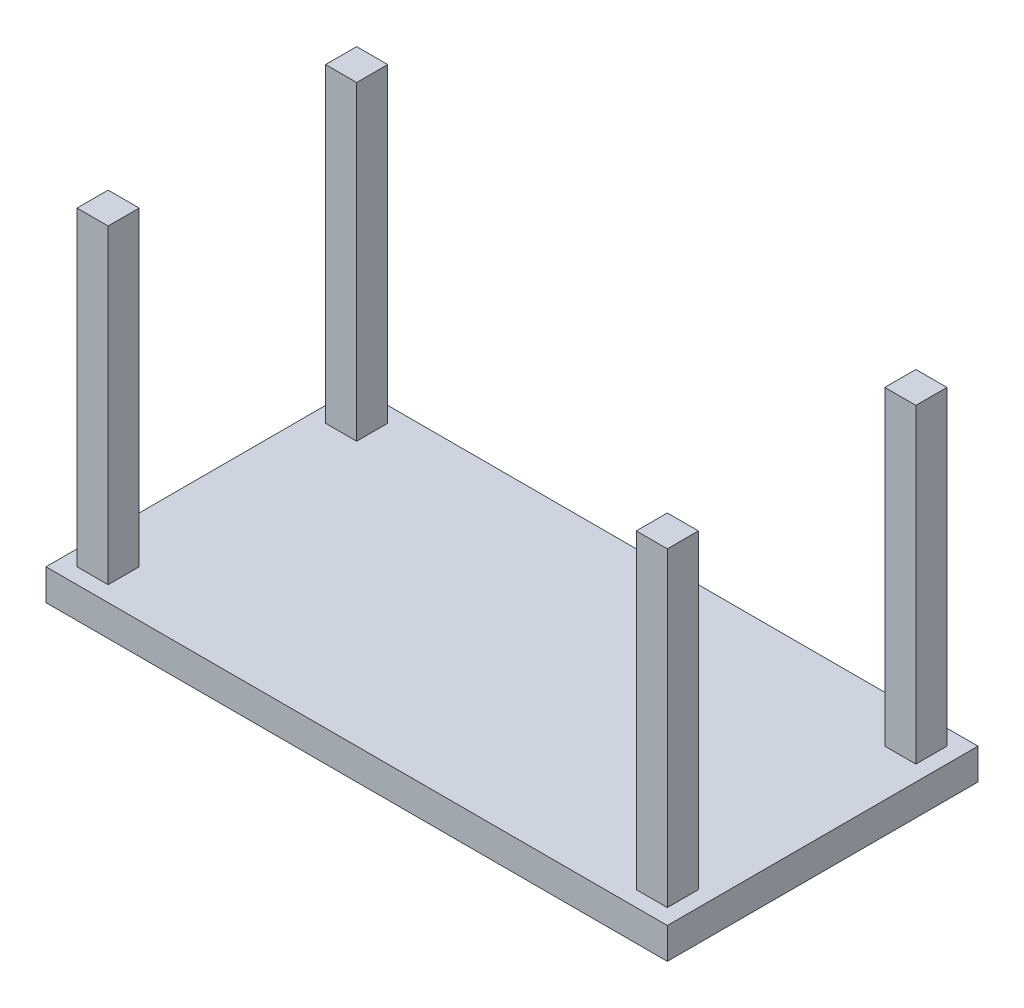
ISO-10303-21;
HEADER;
FILE_DESCRIPTION(('STEP AP214'),'2;1');
FILE_NAME('part.step','',(''),(''),'','','');
FILE_SCHEMA(('AUTOMOTIVE_DESIGN { 1 0 10303 214 1 1 1 1 }'));
ENDSEC;
DATA;
#1=APPLICATION_CONTEXT('core data for automotive mechanical design processes');
#2=APPLICATION_PROTOCOL_DEFINITION('international standard','automotive_design',2000,#1);
#3=PRODUCT_CONTEXT('',#1,'mechanical');
#4=PRODUCT('Part','Part','',(#3));
#5=PRODUCT_RELATED_PRODUCT_CATEGORY('part','',(#4));
#6=PRODUCT_DEFINITION_FORMATION('','',#4);
#7=PRODUCT_DEFINITION_CONTEXT('part definition',#1,'design');
#8=PRODUCT_DEFINITION('design','',#6,#7);
#9=PRODUCT_DEFINITION_SHAPE('','',#8);
#10=(LENGTH_UNIT() NAMED_UNIT(*) SI_UNIT(.MILLI.,.METRE.));
#11=(NAMED_UNIT(*) PLANE_ANGLE_UNIT() SI_UNIT($,.RADIAN.));
#12=(NAMED_UNIT(*) SI_UNIT($,.STERADIAN.) SOLID_ANGLE_UNIT());
#13=UNCERTAINTY_MEASURE_WITH_UNIT(LENGTH_MEASURE(1.E-05),#10,'distance_accuracy_value','');
#14=(GEOMETRIC_REPRESENTATION_CONTEXT(3) GLOBAL_UNCERTAINTY_ASSIGNED_CONTEXT((#13)) GLOBAL_UNIT_ASSIGNED_CONTEXT((#10,
#11,#12)) REPRESENTATION_CONTEXT('',''));
#15=CARTESIAN_POINT('',(0.,0.,0.));
#16=DIRECTION('',(0.,0.,1.));
#17=DIRECTION('',(1.,0.,0.));
#18=AXIS2_PLACEMENT_3D('',#15,#16,#17);
#19=CARTESIAN_POINT('',(0.,10.,0.));
#20=DIRECTION('',(0.,-1.,0.));
#21=DIRECTION('',(0.,0.,-1.));
#22=AXIS2_PLACEMENT_3D('',#19,#20,#21);
#23=PLANE('',#22);
#24=DIRECTION('',(1.,0.,0.));
#25=VECTOR('',#24,1.);
#26=CARTESIAN_POINT('',(95.0000000000001,10.,45.));
#27=LINE('',#26,#25);
#28=CARTESIAN_POINT('',(85.0000000000001,10.,45.));
#29=VERTEX_POINT('',#28);
#30=CARTESIAN_POINT('',(95.0000000000001,10.,45.));
#31=VERTEX_POINT('',#30);
#32=EDGE_CURVE('E253',#29,#31,#27,.T.);
#33=ORIENTED_EDGE('',*,*,#32,.F.);
#34=DIRECTION('',(0.,0.,1.));
#35=VECTOR('',#34,1.);
#36=CARTESIAN_POINT('',(85.0000000000001,10.,45.));
#37=LINE('',#36,#35);
#38=CARTESIAN_POINT('',(85.0000000000001,10.,35.));
#39=VERTEX_POINT('',#38);
#40=EDGE_CURVE('E240',#39,#29,#37,.T.);
#41=ORIENTED_EDGE('',*,*,#40,.F.);
#42=DIRECTION('',(-1.,0.,0.));
#43=VECTOR('',#42,1.);
#44=CARTESIAN_POINT('',(95.0000000000001,10.,35.));
#45=LINE('',#44,#43);
#46=CARTESIAN_POINT('',(95.0000000000001,10.,35.));
#47=VERTEX_POINT('',#46);
#48=EDGE_CURVE('E244',#47,#39,#45,.T.);
#49=ORIENTED_EDGE('',*,*,#48,.F.);
#50=DIRECTION('',(0.,0.,-1.));
#51=VECTOR('',#50,1.);
#52=CARTESIAN_POINT('',(95.0000000000001,10.,45.));
#53=LINE('',#52,#51);
#54=EDGE_CURVE('E249',#31,#47,#53,.T.);
#55=ORIENTED_EDGE('',*,*,#54,.F.);
#56=EDGE_LOOP('',(#33,#41,#49,#55));
#57=FACE_BOUND('',#56,.T.);
#58=DIRECTION('',(0.,0.,-1.));
#59=VECTOR('',#58,1.);
#60=CARTESIAN_POINT('',(-85.,10.,-45.));
#61=LINE('',#60,#59);
#62=CARTESIAN_POINT('',(-85.,10.,-35.));
#63=VERTEX_POINT('',#62);
#64=CARTESIAN_POINT('',(-85.,10.,-45.));
#65=VERTEX_POINT('',#64);
#66=EDGE_CURVE('E302',#63,#65,#61,.T.);
#67=ORIENTED_EDGE('',*,*,#66,.F.);
#68=DIRECTION('',(1.,0.,0.));
#69=VECTOR('',#68,1.);
#70=CARTESIAN_POINT('',(-95.,10.,-35.));
#71=LINE('',#70,#69);
#72=CARTESIAN_POINT('',(-95.,10.,-35.));
#73=VERTEX_POINT('',#72);
#74=EDGE_CURVE('E319',#73,#63,#71,.T.);
#75=ORIENTED_EDGE('',*,*,#74,.F.);
#76=DIRECTION('',(0.,0.,1.));
#77=VECTOR('',#76,1.);
#78=CARTESIAN_POINT('',(-95.,10.,-45.));
#79=LINE('',#78,#77);
#80=CARTESIAN_POINT('',(-95.,10.,-45.));
#81=VERTEX_POINT('',#80);
#82=EDGE_CURVE('E336',#81,#73,#79,.T.);
#83=ORIENTED_EDGE('',*,*,#82,.F.);
#84=DIRECTION('',(-1.,0.,0.));
#85=VECTOR('',#84,1.);
#86=CARTESIAN_POINT('',(-95.,10.,-45.));
#87=LINE('',#86,#85);
#88=EDGE_CURVE('E332',#65,#81,#87,.T.);
#89=ORIENTED_EDGE('',*,*,#88,.F.);
#90=EDGE_LOOP('',(#67,#75,#83,#89));
#91=FACE_BOUND('',#90,.T.);
#92=DIRECTION('',(0.,0.,1.));
#93=VECTOR('',#92,1.);
#94=CARTESIAN_POINT('',(-100.,10.,-50.));
#95=LINE('',#94,#93);
#96=CARTESIAN_POINT('',(-100.,10.,-50.));
#97=VERTEX_POINT('',#96);
#98=CARTESIAN_POINT('',(-100.,10.,50.));
#99=VERTEX_POINT('',#98);
#100=EDGE_CURVE('E359',#97,#99,#95,.T.);
#101=ORIENTED_EDGE('',*,*,#100,.T.);
#102=DIRECTION('',(1.,0.,0.));
#103=VECTOR('',#102,1.);
#104=CARTESIAN_POINT('',(100.,10.,50.));
#105=LINE('',#104,#103);
#106=CARTESIAN_POINT('',(100.,10.,50.));
#107=VERTEX_POINT('',#106);
#108=EDGE_CURVE('E363',#99,#107,#105,.T.);
#109=ORIENTED_EDGE('',*,*,#108,.T.);
#110=DIRECTION('',(0.,0.,-1.));
#111=VECTOR('',#110,1.);
#112=CARTESIAN_POINT('',(100.,10.,-50.));
#113=LINE('',#112,#111);
#114=CARTESIAN_POINT('',(100.,10.,-50.));
#115=VERTEX_POINT('',#114);
#116=EDGE_CURVE('E367',#107,#115,#113,.T.);
#117=ORIENTED_EDGE('',*,*,#116,.T.);
#118=DIRECTION('',(-1.,0.,0.));
#119=VECTOR('',#118,1.);
#120=CARTESIAN_POINT('',(100.,10.,-50.));
#121=LINE('',#120,#119);
#122=EDGE_CURVE('E370',#115,#97,#121,.T.);
#123=ORIENTED_EDGE('',*,*,#122,.T.);
#124=EDGE_LOOP('',(#101,#109,#117,#123));
#125=FACE_BOUND('',#124,.T.);
#126=DIRECTION('',(-1.,0.,0.));
#127=VECTOR('',#126,1.);
#128=CARTESIAN_POINT('',(95.0000000000001,10.,-45.));
#129=LINE('',#128,#127);
#130=CARTESIAN_POINT('',(95.0000000000001,10.,-45.));
#131=VERTEX_POINT('',#130);
#132=CARTESIAN_POINT('',(85.0000000000001,10.,-45.));
#133=VERTEX_POINT('',#132);
#134=EDGE_CURVE('E298',#131,#133,#129,.T.);
#135=ORIENTED_EDGE('',*,*,#134,.F.);
#136=DIRECTION('',(0.,0.,-1.));
#137=VECTOR('',#136,1.);
#138=CARTESIAN_POINT('',(95.0000000000001,10.,-45.));
#139=LINE('',#138,#137);
#140=CARTESIAN_POINT('',(95.0000000000001,10.,-35.));
#141=VERTEX_POINT('',#140);
#142=EDGE_CURVE('E285',#141,#131,#139,.T.);
#143=ORIENTED_EDGE('',*,*,#142,.F.);
#144=DIRECTION('',(1.,0.,0.));
#145=VECTOR('',#144,1.);
#146=CARTESIAN_POINT('',(95.0000000000001,10.,-35.));
#147=LINE('',#146,#145);
#148=CARTESIAN_POINT('',(85.0000000000001,10.,-35.));
#149=VERTEX_POINT('',#148);
#150=EDGE_CURVE('E289',#149,#141,#147,.T.);
#151=ORIENTED_EDGE('',*,*,#150,.F.);
#152=DIRECTION('',(0.,0.,1.));
#153=VECTOR('',#152,1.);
#154=CARTESIAN_POINT('',(85.0000000000001,10.,-45.));
#155=LINE('',#154,#153);
#156=EDGE_CURVE('E294',#133,#149,#155,.T.);
#157=ORIENTED_EDGE('',*,*,#156,.F.);
#158=EDGE_LOOP('',(#135,#143,#151,#157));
#159=FACE_BOUND('',#158,.T.);
#160=DIRECTION('',(0.,0.,1.));
#161=VECTOR('',#160,1.);
#162=CARTESIAN_POINT('',(-95.,10.,45.));
#163=LINE('',#162,#161);
#164=CARTESIAN_POINT('',(-95.,10.,35.));
#165=VERTEX_POINT('',#164);
#166=CARTESIAN_POINT('',(-95.,10.,45.));
#167=VERTEX_POINT('',#166);
#168=EDGE_CURVE('E179',#165,#167,#163,.T.);
#169=ORIENTED_EDGE('',*,*,#168,.F.);
#170=DIRECTION('',(-1.,0.,0.));
#171=VECTOR('',#170,1.);
#172=CARTESIAN_POINT('',(-95.,10.,35.));
#173=LINE('',#172,#171);
#174=CARTESIAN_POINT('',(-85.,10.,35.));
#175=VERTEX_POINT('',#174);
#176=EDGE_CURVE('E181',#175,#165,#173,.T.);
#177=ORIENTED_EDGE('',*,*,#176,.F.);
#178=DIRECTION('',(0.,0.,-1.));
#179=VECTOR('',#178,1.);
#180=CARTESIAN_POINT('',(-85.,10.,45.));
#181=LINE('',#180,#179);
#182=CARTESIAN_POINT('',(-85.,10.,45.));
#183=VERTEX_POINT('',#182);
#184=EDGE_CURVE('E66',#183,#175,#181,.T.);
#185=ORIENTED_EDGE('',*,*,#184,.F.);
#186=DIRECTION('',(1.,0.,0.));
#187=VECTOR('',#186,1.);
#188=CARTESIAN_POINT('',(-95.,10.,45.));
#189=LINE('',#188,#187);
#190=EDGE_CURVE('E61',#167,#183,#189,.T.);
#191=ORIENTED_EDGE('',*,*,#190,.F.);
#192=EDGE_LOOP('',(#169,#177,#185,#191));
#193=FACE_BOUND('',#192,.T.);
#194=ADVANCED_FACE('F45',(#57,#91,#125,#159,#193),#23,.F.);
#195=CARTESIAN_POINT('',(-100.,10.,-50.));
#196=DIRECTION('',(1.,0.,0.));
#197=DIRECTION('',(0.,0.,-1.));
#198=AXIS2_PLACEMENT_3D('',#195,#196,#197);
#199=PLANE('',#198);
#200=DIRECTION('',(0.,0.,1.));
#201=VECTOR('',#200,1.);
#202=CARTESIAN_POINT('',(-100.,0.,-50.));
#203=LINE('',#202,#201);
#204=CARTESIAN_POINT('',(-100.,0.,-50.));
#205=VERTEX_POINT('',#204);
#206=CARTESIAN_POINT('',(-100.,0.,50.));
#207=VERTEX_POINT('',#206);
#208=EDGE_CURVE('E358',#205,#207,#203,.T.);
#209=ORIENTED_EDGE('',*,*,#208,.T.);
#210=DIRECTION('',(0.,-1.,0.));
#211=VECTOR('',#210,1.);
#212=CARTESIAN_POINT('',(-100.,10.,50.));
#213=LINE('',#212,#211);
#214=EDGE_CURVE('E11',#99,#207,#213,.T.);
#215=ORIENTED_EDGE('',*,*,#214,.F.);
#216=ORIENTED_EDGE('',*,*,#100,.F.);
#217=DIRECTION('',(0.,-1.,0.));
#218=VECTOR('',#217,1.);
#219=CARTESIAN_POINT('',(-100.,10.,-50.));
#220=LINE('',#219,#218);
#221=EDGE_CURVE('E373',#97,#205,#220,.T.);
#222=ORIENTED_EDGE('',*,*,#221,.T.);
#223=EDGE_LOOP('',(#209,#215,#216,#222));
#224=FACE_BOUND('',#223,.T.);
#225=ADVANCED_FACE('F47',(#224),#199,.F.);
#226=CARTESIAN_POINT('',(100.,10.,50.));
#227=DIRECTION('',(0.,0.,-1.));
#228=DIRECTION('',(-1.,0.,0.));
#229=AXIS2_PLACEMENT_3D('',#226,#227,#228);
#230=PLANE('',#229);
#231=DIRECTION('',(1.,0.,0.));
#232=VECTOR('',#231,1.);
#233=CARTESIAN_POINT('',(100.,0.,50.));
#234=LINE('',#233,#232);
#235=CARTESIAN_POINT('',(100.,0.,50.));
#236=VERTEX_POINT('',#235);
#237=EDGE_CURVE('E377',#207,#236,#234,.T.);
#238=ORIENTED_EDGE('',*,*,#237,.T.);
#239=DIRECTION('',(0.,-1.,0.));
#240=VECTOR('',#239,1.);
#241=CARTESIAN_POINT('',(100.,10.,50.));
#242=LINE('',#241,#240);
#243=EDGE_CURVE('E54',#107,#236,#242,.T.);
#244=ORIENTED_EDGE('',*,*,#243,.F.);
#245=ORIENTED_EDGE('',*,*,#108,.F.);
#246=ORIENTED_EDGE('',*,*,#214,.T.);
#247=EDGE_LOOP('',(#238,#244,#245,#246));
#248=FACE_BOUND('',#247,.T.);
#249=ADVANCED_FACE('F413',(#248),#230,.F.);
#250=CARTESIAN_POINT('',(100.,10.,-50.));
#251=DIRECTION('',(-1.,0.,0.));
#252=DIRECTION('',(0.,0.,1.));
#253=AXIS2_PLACEMENT_3D('',#250,#251,#252);
#254=PLANE('',#253);
#255=DIRECTION('',(0.,0.,-1.));
#256=VECTOR('',#255,1.);
#257=CARTESIAN_POINT('',(100.,0.,-50.));
#258=LINE('',#257,#256);
#259=CARTESIAN_POINT('',(100.,0.,-50.));
#260=VERTEX_POINT('',#259);
#261=EDGE_CURVE('E380',#236,#260,#258,.T.);
#262=ORIENTED_EDGE('',*,*,#261,.T.);
#263=DIRECTION('',(0.,-1.,0.));
#264=VECTOR('',#263,1.);
#265=CARTESIAN_POINT('',(100.,10.,-50.));
#266=LINE('',#265,#264);
#267=EDGE_CURVE('E388',#115,#260,#266,.T.);
#268=ORIENTED_EDGE('',*,*,#267,.F.);
#269=ORIENTED_EDGE('',*,*,#116,.F.);
#270=ORIENTED_EDGE('',*,*,#243,.T.);
#271=EDGE_LOOP('',(#262,#268,#269,#270));
#272=FACE_BOUND('',#271,.T.);
#273=ADVANCED_FACE('F397',(#272),#254,.F.);
#274=CARTESIAN_POINT('',(100.,10.,-50.));
#275=DIRECTION('',(0.,0.,1.));
#276=DIRECTION('',(1.,0.,0.));
#277=AXIS2_PLACEMENT_3D('',#274,#275,#276);
#278=PLANE('',#277);
#279=DIRECTION('',(-1.,0.,0.));
#280=VECTOR('',#279,1.);
#281=CARTESIAN_POINT('',(100.,0.,-50.));
#282=LINE('',#281,#280);
#283=EDGE_CURVE('E364',#260,#205,#282,.T.);
#284=ORIENTED_EDGE('',*,*,#283,.T.);
#285=ORIENTED_EDGE('',*,*,#221,.F.);
#286=ORIENTED_EDGE('',*,*,#122,.F.);
#287=ORIENTED_EDGE('',*,*,#267,.T.);
#288=EDGE_LOOP('',(#284,#285,#286,#287));
#289=FACE_BOUND('',#288,.T.);
#290=ADVANCED_FACE('F406',(#289),#278,.F.);
#291=CARTESIAN_POINT('',(0.,0.,0.));
#292=DIRECTION('',(0.,-1.,0.));
#293=DIRECTION('',(0.,0.,-1.));
#294=AXIS2_PLACEMENT_3D('',#291,#292,#293);
#295=PLANE('',#294);
#296=ORIENTED_EDGE('',*,*,#208,.F.);
#297=ORIENTED_EDGE('',*,*,#283,.F.);
#298=ORIENTED_EDGE('',*,*,#261,.F.);
#299=ORIENTED_EDGE('',*,*,#237,.F.);
#300=EDGE_LOOP('',(#296,#297,#298,#299));
#301=FACE_BOUND('',#300,.T.);
#302=ADVANCED_FACE('F403',(#301),#295,.T.);
#303=CARTESIAN_POINT('',(-85.,110.,-45.));
#304=DIRECTION('',(-1.,0.,0.));
#305=DIRECTION('',(0.,0.,1.));
#306=AXIS2_PLACEMENT_3D('',#303,#304,#305);
#307=PLANE('',#306);
#308=ORIENTED_EDGE('',*,*,#66,.T.);
#309=DIRECTION('',(0.,-1.,0.));
#310=VECTOR('',#309,1.);
#311=CARTESIAN_POINT('',(-85.,110.,-45.));
#312=LINE('',#311,#310);
#313=CARTESIAN_POINT('',(-85.,110.,-45.));
#314=VERTEX_POINT('',#313);
#315=EDGE_CURVE('E354',#314,#65,#312,.T.);
#316=ORIENTED_EDGE('',*,*,#315,.F.);
#317=DIRECTION('',(0.,0.,-1.));
#318=VECTOR('',#317,1.);
#319=CARTESIAN_POINT('',(-85.,110.,-45.));
#320=LINE('',#319,#318);
#321=CARTESIAN_POINT('',(-85.,110.,-35.));
#322=VERTEX_POINT('',#321);
#323=EDGE_CURVE('E314',#322,#314,#320,.T.);
#324=ORIENTED_EDGE('',*,*,#323,.F.);
#325=DIRECTION('',(0.,-1.,0.));
#326=VECTOR('',#325,1.);
#327=CARTESIAN_POINT('',(-85.,110.,-35.));
#328=LINE('',#327,#326);
#329=EDGE_CURVE('E328',#322,#63,#328,.T.);
#330=ORIENTED_EDGE('',*,*,#329,.T.);
#331=EDGE_LOOP('',(#308,#316,#324,#330));
#332=FACE_BOUND('',#331,.T.);
#333=ADVANCED_FACE('F430',(#332),#307,.F.);
#334=CARTESIAN_POINT('',(-95.,110.,-45.));
#335=DIRECTION('',(0.,0.,1.));
#336=DIRECTION('',(1.,0.,0.));
#337=AXIS2_PLACEMENT_3D('',#334,#335,#336);
#338=PLANE('',#337);
#339=ORIENTED_EDGE('',*,*,#88,.T.);
#340=DIRECTION('',(0.,-1.,0.));
#341=VECTOR('',#340,1.);
#342=CARTESIAN_POINT('',(-95.,110.,-45.));
#343=LINE('',#342,#341);
#344=CARTESIAN_POINT('',(-95.,110.,-45.));
#345=VERTEX_POINT('',#344);
#346=EDGE_CURVE('E350',#345,#81,#343,.T.);
#347=ORIENTED_EDGE('',*,*,#346,.F.);
#348=DIRECTION('',(-1.,0.,0.));
#349=VECTOR('',#348,1.);
#350=CARTESIAN_POINT('',(-95.,110.,-45.));
#351=LINE('',#350,#349);
#352=EDGE_CURVE('E318',#314,#345,#351,.T.);
#353=ORIENTED_EDGE('',*,*,#352,.F.);
#354=ORIENTED_EDGE('',*,*,#315,.T.);
#355=EDGE_LOOP('',(#339,#347,#353,#354));
#356=FACE_BOUND('',#355,.T.);
#357=ADVANCED_FACE('F456',(#356),#338,.F.);
#358=CARTESIAN_POINT('',(-95.,110.,-45.));
#359=DIRECTION('',(1.,0.,0.));
#360=DIRECTION('',(0.,0.,-1.));
#361=AXIS2_PLACEMENT_3D('',#358,#359,#360);
#362=PLANE('',#361);
#363=ORIENTED_EDGE('',*,*,#82,.T.);
#364=DIRECTION('',(0.,-1.,0.));
#365=VECTOR('',#364,1.);
#366=CARTESIAN_POINT('',(-95.,110.,-35.));
#367=LINE('',#366,#365);
#368=CARTESIAN_POINT('',(-95.,110.,-35.));
#369=VERTEX_POINT('',#368);
#370=EDGE_CURVE('E346',#369,#73,#367,.T.);
#371=ORIENTED_EDGE('',*,*,#370,.F.);
#372=DIRECTION('',(0.,0.,1.));
#373=VECTOR('',#372,1.);
#374=CARTESIAN_POINT('',(-95.,110.,-45.));
#375=LINE('',#374,#373);
#376=EDGE_CURVE('E322',#345,#369,#375,.T.);
#377=ORIENTED_EDGE('',*,*,#376,.F.);
#378=ORIENTED_EDGE('',*,*,#346,.T.);
#379=EDGE_LOOP('',(#363,#371,#377,#378));
#380=FACE_BOUND('',#379,.T.);
#381=ADVANCED_FACE('F465',(#380),#362,.F.);
#382=CARTESIAN_POINT('',(-95.,110.,-35.));
#383=DIRECTION('',(0.,0.,-1.));
#384=DIRECTION('',(-1.,0.,0.));
#385=AXIS2_PLACEMENT_3D('',#382,#383,#384);
#386=PLANE('',#385);
#387=ORIENTED_EDGE('',*,*,#74,.T.);
#388=ORIENTED_EDGE('',*,*,#329,.F.);
#389=DIRECTION('',(1.,0.,0.));
#390=VECTOR('',#389,1.);
#391=CARTESIAN_POINT('',(-95.,110.,-35.));
#392=LINE('',#391,#390);
#393=EDGE_CURVE('E325',#369,#322,#392,.T.);
#394=ORIENTED_EDGE('',*,*,#393,.F.);
#395=ORIENTED_EDGE('',*,*,#370,.T.);
#396=EDGE_LOOP('',(#387,#388,#394,#395));
#397=FACE_BOUND('',#396,.T.);
#398=ADVANCED_FACE('F474',(#397),#386,.F.);
#399=CARTESIAN_POINT('',(0.,110.,0.));
#400=DIRECTION('',(0.,1.,0.));
#401=DIRECTION('',(0.,0.,1.));
#402=AXIS2_PLACEMENT_3D('',#399,#400,#401);
#403=PLANE('',#402);
#404=ORIENTED_EDGE('',*,*,#323,.T.);
#405=ORIENTED_EDGE('',*,*,#352,.T.);
#406=ORIENTED_EDGE('',*,*,#376,.T.);
#407=ORIENTED_EDGE('',*,*,#393,.T.);
#408=EDGE_LOOP('',(#404,#405,#406,#407));
#409=FACE_BOUND('',#408,.T.);
#410=ADVANCED_FACE('F484',(#409),#403,.T.);
#411=CARTESIAN_POINT('',(95.0000000000001,110.,-45.));
#412=DIRECTION('',(0.,0.,1.));
#413=DIRECTION('',(1.,0.,0.));
#414=AXIS2_PLACEMENT_3D('',#411,#412,#413);
#415=PLANE('',#414);
#416=ORIENTED_EDGE('',*,*,#134,.T.);
#417=DIRECTION('',(0.,-1.,0.));
#418=VECTOR('',#417,1.);
#419=CARTESIAN_POINT('',(85.0000000000001,110.,-45.));
#420=LINE('',#419,#418);
#421=CARTESIAN_POINT('',(85.0000000000001,110.,-45.));
#422=VERTEX_POINT('',#421);
#423=EDGE_CURVE('E257',#422,#133,#420,.T.);
#424=ORIENTED_EDGE('',*,*,#423,.F.);
#425=DIRECTION('',(-1.,0.,0.));
#426=VECTOR('',#425,1.);
#427=CARTESIAN_POINT('',(95.0000000000001,110.,-45.));
#428=LINE('',#427,#426);
#429=CARTESIAN_POINT('',(95.0000000000001,110.,-45.));
#430=VERTEX_POINT('',#429);
#431=EDGE_CURVE('E290',#430,#422,#428,.T.);
#432=ORIENTED_EDGE('',*,*,#431,.F.);
#433=DIRECTION('',(0.,-1.,0.));
#434=VECTOR('',#433,1.);
#435=CARTESIAN_POINT('',(95.0000000000001,110.,-45.));
#436=LINE('',#435,#434);
#437=EDGE_CURVE('E280',#430,#131,#436,.T.);
#438=ORIENTED_EDGE('',*,*,#437,.T.);
#439=EDGE_LOOP('',(#416,#424,#432,#438));
#440=FACE_BOUND('',#439,.T.);
#441=ADVANCED_FACE('F494',(#440),#415,.F.);
#442=CARTESIAN_POINT('',(85.0000000000001,110.,-45.));
#443=DIRECTION('',(1.,0.,0.));
#444=DIRECTION('',(0.,0.,-1.));
#445=AXIS2_PLACEMENT_3D('',#442,#443,#444);
#446=PLANE('',#445);
#447=ORIENTED_EDGE('',*,*,#156,.T.);
#448=DIRECTION('',(0.,-1.,0.));
#449=VECTOR('',#448,1.);
#450=CARTESIAN_POINT('',(85.0000000000001,110.,-35.));
#451=LINE('',#450,#449);
#452=CARTESIAN_POINT('',(85.0000000000001,110.,-35.));
#453=VERTEX_POINT('',#452);
#454=EDGE_CURVE('E272',#453,#149,#451,.T.);
#455=ORIENTED_EDGE('',*,*,#454,.F.);
#456=DIRECTION('',(0.,0.,1.));
#457=VECTOR('',#456,1.);
#458=CARTESIAN_POINT('',(85.0000000000001,110.,-45.));
#459=LINE('',#458,#457);
#460=EDGE_CURVE('E308',#422,#453,#459,.T.);
#461=ORIENTED_EDGE('',*,*,#460,.F.);
#462=ORIENTED_EDGE('',*,*,#423,.T.);
#463=EDGE_LOOP('',(#447,#455,#461,#462));
#464=FACE_BOUND('',#463,.T.);
#465=ADVANCED_FACE('F504',(#464),#446,.F.);
#466=CARTESIAN_POINT('',(95.0000000000001,110.,-35.));
#467=DIRECTION('',(0.,0.,-1.));
#468=DIRECTION('',(-1.,0.,0.));
#469=AXIS2_PLACEMENT_3D('',#466,#467,#468);
#470=PLANE('',#469);
#471=ORIENTED_EDGE('',*,*,#150,.T.);
#472=DIRECTION('',(0.,-1.,0.));
#473=VECTOR('',#472,1.);
#474=CARTESIAN_POINT('',(95.0000000000001,110.,-35.));
#475=LINE('',#474,#473);
#476=CARTESIAN_POINT('',(95.0000000000001,110.,-35.));
#477=VERTEX_POINT('',#476);
#478=EDGE_CURVE('E276',#477,#141,#475,.T.);
#479=ORIENTED_EDGE('',*,*,#478,.F.);
#480=DIRECTION('',(1.,0.,0.));
#481=VECTOR('',#480,1.);
#482=CARTESIAN_POINT('',(95.0000000000001,110.,-35.));
#483=LINE('',#482,#481);
#484=EDGE_CURVE('E305',#453,#477,#483,.T.);
#485=ORIENTED_EDGE('',*,*,#484,.F.);
#486=ORIENTED_EDGE('',*,*,#454,.T.);
#487=EDGE_LOOP('',(#471,#479,#485,#486));
#488=FACE_BOUND('',#487,.T.);
#489=ADVANCED_FACE('F514',(#488),#470,.F.);
#490=CARTESIAN_POINT('',(95.0000000000001,110.,-45.));
#491=DIRECTION('',(-1.,0.,0.));
#492=DIRECTION('',(0.,0.,1.));
#493=AXIS2_PLACEMENT_3D('',#490,#491,#492);
#494=PLANE('',#493);
#495=ORIENTED_EDGE('',*,*,#142,.T.);
#496=ORIENTED_EDGE('',*,*,#437,.F.);
#497=DIRECTION('',(0.,0.,-1.));
#498=VECTOR('',#497,1.);
#499=CARTESIAN_POINT('',(95.0000000000001,110.,-45.));
#500=LINE('',#499,#498);
#501=EDGE_CURVE('E284',#477,#430,#500,.T.);
#502=ORIENTED_EDGE('',*,*,#501,.F.);
#503=ORIENTED_EDGE('',*,*,#478,.T.);
#504=EDGE_LOOP('',(#495,#496,#502,#503));
#505=FACE_BOUND('',#504,.T.);
#506=ADVANCED_FACE('F524',(#505),#494,.F.);
#507=CARTESIAN_POINT('',(0.,110.,0.));
#508=DIRECTION('',(0.,1.,0.));
#509=DIRECTION('',(0.,0.,1.));
#510=AXIS2_PLACEMENT_3D('',#507,#508,#509);
#511=PLANE('',#510);
#512=ORIENTED_EDGE('',*,*,#431,.T.);
#513=ORIENTED_EDGE('',*,*,#460,.T.);
#514=ORIENTED_EDGE('',*,*,#484,.T.);
#515=ORIENTED_EDGE('',*,*,#501,.T.);
#516=EDGE_LOOP('',(#512,#513,#514,#515));
#517=FACE_BOUND('',#516,.T.);
#518=ADVANCED_FACE('F534',(#517),#511,.T.);
#519=CARTESIAN_POINT('',(95.0000000000001,110.,45.));
#520=DIRECTION('',(0.,0.,-1.));
#521=DIRECTION('',(-1.,0.,0.));
#522=AXIS2_PLACEMENT_3D('',#519,#520,#521);
#523=PLANE('',#522);
#524=ORIENTED_EDGE('',*,*,#32,.T.);
#525=DIRECTION('',(0.,-1.,0.));
#526=VECTOR('',#525,1.);
#527=CARTESIAN_POINT('',(95.0000000000001,110.,45.));
#528=LINE('',#527,#526);
#529=CARTESIAN_POINT('',(95.0000000000001,110.,45.));
#530=VERTEX_POINT('',#529);
#531=EDGE_CURVE('E186',#530,#31,#528,.T.);
#532=ORIENTED_EDGE('',*,*,#531,.F.);
#533=DIRECTION('',(1.,0.,0.));
#534=VECTOR('',#533,1.);
#535=CARTESIAN_POINT('',(95.0000000000001,110.,45.));
#536=LINE('',#535,#534);
#537=CARTESIAN_POINT('',(85.0000000000001,110.,45.));
#538=VERTEX_POINT('',#537);
#539=EDGE_CURVE('E245',#538,#530,#536,.T.);
#540=ORIENTED_EDGE('',*,*,#539,.F.);
#541=DIRECTION('',(0.,-1.,0.));
#542=VECTOR('',#541,1.);
#543=CARTESIAN_POINT('',(85.0000000000001,110.,45.));
#544=LINE('',#543,#542);
#545=EDGE_CURVE('E235',#538,#29,#544,.T.);
#546=ORIENTED_EDGE('',*,*,#545,.T.);
#547=EDGE_LOOP('',(#524,#532,#540,#546));
#548=FACE_BOUND('',#547,.T.);
#549=ADVANCED_FACE('F544',(#548),#523,.F.);
#550=CARTESIAN_POINT('',(95.0000000000001,110.,45.));
#551=DIRECTION('',(-1.,0.,0.));
#552=DIRECTION('',(0.,0.,1.));
#553=AXIS2_PLACEMENT_3D('',#550,#551,#552);
#554=PLANE('',#553);
#555=ORIENTED_EDGE('',*,*,#54,.T.);
#556=DIRECTION('',(0.,-1.,0.));
#557=VECTOR('',#556,1.);
#558=CARTESIAN_POINT('',(95.0000000000001,110.,35.));
#559=LINE('',#558,#557);
#560=CARTESIAN_POINT('',(95.0000000000001,110.,35.));
#561=VERTEX_POINT('',#560);
#562=EDGE_CURVE('E227',#561,#47,#559,.T.);
#563=ORIENTED_EDGE('',*,*,#562,.F.);
#564=DIRECTION('',(0.,0.,-1.));
#565=VECTOR('',#564,1.);
#566=CARTESIAN_POINT('',(95.0000000000001,110.,45.));
#567=LINE('',#566,#565);
#568=EDGE_CURVE('E263',#530,#561,#567,.T.);
#569=ORIENTED_EDGE('',*,*,#568,.F.);
#570=ORIENTED_EDGE('',*,*,#531,.T.);
#571=EDGE_LOOP('',(#555,#563,#569,#570));
#572=FACE_BOUND('',#571,.T.);
#573=ADVANCED_FACE('F554',(#572),#554,.F.);
#574=CARTESIAN_POINT('',(95.0000000000001,110.,35.));
#575=DIRECTION('',(0.,0.,1.));
#576=DIRECTION('',(1.,0.,0.));
#577=AXIS2_PLACEMENT_3D('',#574,#575,#576);
#578=PLANE('',#577);
#579=ORIENTED_EDGE('',*,*,#48,.T.);
#580=DIRECTION('',(0.,-1.,0.));
#581=VECTOR('',#580,1.);
#582=CARTESIAN_POINT('',(85.0000000000001,110.,35.));
#583=LINE('',#582,#581);
#584=CARTESIAN_POINT('',(85.0000000000001,110.,35.));
#585=VERTEX_POINT('',#584);
#586=EDGE_CURVE('E231',#585,#39,#583,.T.);
#587=ORIENTED_EDGE('',*,*,#586,.F.);
#588=DIRECTION('',(-1.,0.,0.));
#589=VECTOR('',#588,1.);
#590=CARTESIAN_POINT('',(95.0000000000001,110.,35.));
#591=LINE('',#590,#589);
#592=EDGE_CURVE('E260',#561,#585,#591,.T.);
#593=ORIENTED_EDGE('',*,*,#592,.F.);
#594=ORIENTED_EDGE('',*,*,#562,.T.);
#595=EDGE_LOOP('',(#579,#587,#593,#594));
#596=FACE_BOUND('',#595,.T.);
#597=ADVANCED_FACE('F564',(#596),#578,.F.);
#598=CARTESIAN_POINT('',(85.0000000000001,110.,45.));
#599=DIRECTION('',(1.,0.,0.));
#600=DIRECTION('',(0.,0.,-1.));
#601=AXIS2_PLACEMENT_3D('',#598,#599,#600);
#602=PLANE('',#601);
#603=ORIENTED_EDGE('',*,*,#40,.T.);
#604=ORIENTED_EDGE('',*,*,#545,.F.);
#605=DIRECTION('',(0.,0.,1.));
#606=VECTOR('',#605,1.);
#607=CARTESIAN_POINT('',(85.0000000000001,110.,45.));
#608=LINE('',#607,#606);
#609=EDGE_CURVE('E239',#585,#538,#608,.T.);
#610=ORIENTED_EDGE('',*,*,#609,.F.);
#611=ORIENTED_EDGE('',*,*,#586,.T.);
#612=EDGE_LOOP('',(#603,#604,#610,#611));
#613=FACE_BOUND('',#612,.T.);
#614=ADVANCED_FACE('F574',(#613),#602,.F.);
#615=CARTESIAN_POINT('',(0.,110.,0.));
#616=DIRECTION('',(0.,-1.,0.));
#617=DIRECTION('',(0.,0.,-1.));
#618=AXIS2_PLACEMENT_3D('',#615,#616,#617);
#619=PLANE('',#618);
#620=ORIENTED_EDGE('',*,*,#539,.T.);
#621=ORIENTED_EDGE('',*,*,#568,.T.);
#622=ORIENTED_EDGE('',*,*,#592,.T.);
#623=ORIENTED_EDGE('',*,*,#609,.T.);
#624=EDGE_LOOP('',(#620,#621,#622,#623));
#625=FACE_BOUND('',#624,.T.);
#626=ADVANCED_FACE('F584',(#625),#619,.F.);
#627=CARTESIAN_POINT('',(-95.,110.,45.));
#628=DIRECTION('',(1.,0.,0.));
#629=DIRECTION('',(0.,0.,-1.));
#630=AXIS2_PLACEMENT_3D('',#627,#628,#629);
#631=PLANE('',#630);
#632=ORIENTED_EDGE('',*,*,#168,.T.);
#633=DIRECTION('',(0.,-1.,0.));
#634=VECTOR('',#633,1.);
#635=CARTESIAN_POINT('',(-95.,110.,45.));
#636=LINE('',#635,#634);
#637=CARTESIAN_POINT('',(-95.,110.,45.));
#638=VERTEX_POINT('',#637);
#639=EDGE_CURVE('E644',#638,#167,#636,.T.);
#640=ORIENTED_EDGE('',*,*,#639,.F.);
#641=DIRECTION('',(0.,0.,1.));
#642=VECTOR('',#641,1.);
#643=CARTESIAN_POINT('',(-95.,110.,45.));
#644=LINE('',#643,#642);
#645=CARTESIAN_POINT('',(-95.,110.,35.));
#646=VERTEX_POINT('',#645);
#647=EDGE_CURVE('E198',#646,#638,#644,.T.);
#648=ORIENTED_EDGE('',*,*,#647,.F.);
#649=DIRECTION('',(0.,-1.,0.));
#650=VECTOR('',#649,1.);
#651=CARTESIAN_POINT('',(-95.,110.,35.));
#652=LINE('',#651,#650);
#653=EDGE_CURVE('E193',#646,#165,#652,.T.);
#654=ORIENTED_EDGE('',*,*,#653,.T.);
#655=EDGE_LOOP('',(#632,#640,#648,#654));
#656=FACE_BOUND('',#655,.T.);
#657=ADVANCED_FACE('F200',(#656),#631,.F.);
#658=CARTESIAN_POINT('',(-95.,110.,45.));
#659=DIRECTION('',(0.,0.,-1.));
#660=DIRECTION('',(-1.,0.,0.));
#661=AXIS2_PLACEMENT_3D('',#658,#659,#660);
#662=PLANE('',#661);
#663=ORIENTED_EDGE('',*,*,#190,.T.);
#664=DIRECTION('',(0.,-1.,0.));
#665=VECTOR('',#664,1.);
#666=CARTESIAN_POINT('',(-85.,110.,45.));
#667=LINE('',#666,#665);
#668=CARTESIAN_POINT('',(-85.,110.,45.));
#669=VERTEX_POINT('',#668);
#670=EDGE_CURVE('E209',#669,#183,#667,.T.);
#671=ORIENTED_EDGE('',*,*,#670,.F.);
#672=DIRECTION('',(1.,0.,0.));
#673=VECTOR('',#672,1.);
#674=CARTESIAN_POINT('',(-95.,110.,45.));
#675=LINE('',#674,#673);
#676=EDGE_CURVE('E219',#638,#669,#675,.T.);
#677=ORIENTED_EDGE('',*,*,#676,.F.);
#678=ORIENTED_EDGE('',*,*,#639,.T.);
#679=EDGE_LOOP('',(#663,#671,#677,#678));
#680=FACE_BOUND('',#679,.T.);
#681=ADVANCED_FACE('F603',(#680),#662,.F.);
#682=CARTESIAN_POINT('',(-85.,110.,45.));
#683=DIRECTION('',(-1.,0.,0.));
#684=DIRECTION('',(0.,0.,1.));
#685=AXIS2_PLACEMENT_3D('',#682,#683,#684);
#686=PLANE('',#685);
#687=ORIENTED_EDGE('',*,*,#184,.T.);
#688=DIRECTION('',(0.,-1.,0.));
#689=VECTOR('',#688,1.);
#690=CARTESIAN_POINT('',(-85.,110.,35.));
#691=LINE('',#690,#689);
#692=CARTESIAN_POINT('',(-85.,110.,35.));
#693=VERTEX_POINT('',#692);
#694=EDGE_CURVE('E196',#693,#175,#691,.T.);
#695=ORIENTED_EDGE('',*,*,#694,.F.);
#696=DIRECTION('',(0.,0.,-1.));
#697=VECTOR('',#696,1.);
#698=CARTESIAN_POINT('',(-85.,110.,45.));
#699=LINE('',#698,#697);
#700=EDGE_CURVE('E207',#669,#693,#699,.T.);
#701=ORIENTED_EDGE('',*,*,#700,.F.);
#702=ORIENTED_EDGE('',*,*,#670,.T.);
#703=EDGE_LOOP('',(#687,#695,#701,#702));
#704=FACE_BOUND('',#703,.T.);
#705=ADVANCED_FACE('F612',(#704),#686,.F.);
#706=CARTESIAN_POINT('',(-95.,110.,35.));
#707=DIRECTION('',(0.,0.,1.));
#708=DIRECTION('',(1.,0.,0.));
#709=AXIS2_PLACEMENT_3D('',#706,#707,#708);
#710=PLANE('',#709);
#711=ORIENTED_EDGE('',*,*,#176,.T.);
#712=ORIENTED_EDGE('',*,*,#653,.F.);
#713=DIRECTION('',(-1.,0.,0.));
#714=VECTOR('',#713,1.);
#715=CARTESIAN_POINT('',(-95.,110.,35.));
#716=LINE('',#715,#714);
#717=EDGE_CURVE('E203',#693,#646,#716,.T.);
#718=ORIENTED_EDGE('',*,*,#717,.F.);
#719=ORIENTED_EDGE('',*,*,#694,.T.);
#720=EDGE_LOOP('',(#711,#712,#718,#719));
#721=FACE_BOUND('',#720,.T.);
#722=ADVANCED_FACE('F191',(#721),#710,.F.);
#723=CARTESIAN_POINT('',(0.,110.,0.));
#724=DIRECTION('',(0.,-1.,0.));
#725=DIRECTION('',(0.,0.,-1.));
#726=AXIS2_PLACEMENT_3D('',#723,#724,#725);
#727=PLANE('',#726);
#728=ORIENTED_EDGE('',*,*,#647,.T.);
#729=ORIENTED_EDGE('',*,*,#676,.T.);
#730=ORIENTED_EDGE('',*,*,#700,.T.);
#731=ORIENTED_EDGE('',*,*,#717,.T.);
#732=EDGE_LOOP('',(#728,#729,#730,#731));
#733=FACE_BOUND('',#732,.T.);
#734=ADVANCED_FACE('F631',(#733),#727,.F.);
#735=CLOSED_SHELL('',(#194,#225,#249,#273,#290,#302,#333,#357,#381,#398,#410,#441,#465,#489,
#506,#518,#549,#573,#597,#614,#626,#657,#681,#705,#722,#734));
#736=MANIFOLD_SOLID_BREP('B2',#735);
#737=ADVANCED_BREP_SHAPE_REPRESENTATION('',(#18,#736),#14);
#738=SHAPE_DEFINITION_REPRESENTATION(#9,#737);
ENDSEC;
END-ISO-10303-21;
